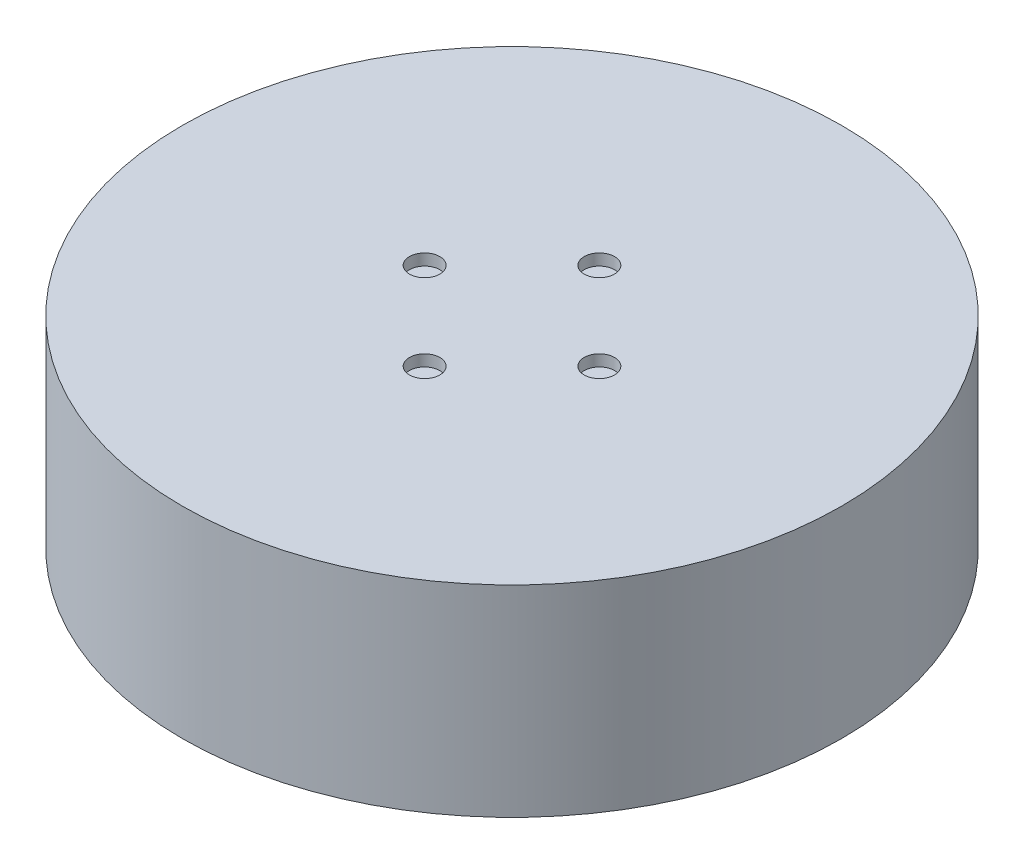
ISO-10303-21;
HEADER;
FILE_DESCRIPTION(('STEP AP214'),'2;1');
FILE_NAME('part.step','',(''),(''),'','','');
FILE_SCHEMA(('AUTOMOTIVE_DESIGN { 1 0 10303 214 1 1 1 1 }'));
ENDSEC;
DATA;
#1=APPLICATION_CONTEXT('core data for automotive mechanical design processes');
#2=APPLICATION_PROTOCOL_DEFINITION('international standard','automotive_design',2000,#1);
#3=PRODUCT_CONTEXT('',#1,'mechanical');
#4=PRODUCT('Part','Part','',(#3));
#5=PRODUCT_RELATED_PRODUCT_CATEGORY('part','',(#4));
#6=PRODUCT_DEFINITION_FORMATION('','',#4);
#7=PRODUCT_DEFINITION_CONTEXT('part definition',#1,'design');
#8=PRODUCT_DEFINITION('design','',#6,#7);
#9=PRODUCT_DEFINITION_SHAPE('','',#8);
#10=(LENGTH_UNIT() NAMED_UNIT(*) SI_UNIT(.MILLI.,.METRE.));
#11=(NAMED_UNIT(*) PLANE_ANGLE_UNIT() SI_UNIT($,.RADIAN.));
#12=(NAMED_UNIT(*) SI_UNIT($,.STERADIAN.) SOLID_ANGLE_UNIT());
#13=UNCERTAINTY_MEASURE_WITH_UNIT(LENGTH_MEASURE(1.E-05),#10,'distance_accuracy_value','');
#14=(GEOMETRIC_REPRESENTATION_CONTEXT(3) GLOBAL_UNCERTAINTY_ASSIGNED_CONTEXT((#13)) GLOBAL_UNIT_ASSIGNED_CONTEXT((#10,
#11,#12)) REPRESENTATION_CONTEXT('',''));
#15=CARTESIAN_POINT('',(0.,0.,0.));
#16=DIRECTION('',(0.,0.,1.));
#17=DIRECTION('',(1.,0.,0.));
#18=AXIS2_PLACEMENT_3D('',#15,#16,#17);
#19=CARTESIAN_POINT('',(0.,0.,0.));
#20=DIRECTION('',(0.,1.,0.));
#21=DIRECTION('',(0.,0.,1.));
#22=AXIS2_PLACEMENT_3D('',#19,#20,#21);
#23=PLANE('',#22);
#24=CARTESIAN_POINT('',(0.,0.,0.));
#25=DIRECTION('',(0.,1.,0.));
#26=DIRECTION('',(0.,0.,1.));
#27=AXIS2_PLACEMENT_3D('',#24,#25,#26);
#28=CIRCLE('',#27,43.4);
#29=CARTESIAN_POINT('',(0.,0.,43.4));
#30=VERTEX_POINT('',#29);
#31=EDGE_CURVE('E43',#30,#30,#28,.T.);
#32=ORIENTED_EDGE('',*,*,#31,.F.);
#33=EDGE_LOOP('',(#32));
#34=FACE_BOUND('',#33,.T.);
#35=CARTESIAN_POINT('',(-16.,0.,0.));
#36=DIRECTION('',(0.,-1.,0.));
#37=DIRECTION('',(0.,0.,-1.));
#38=AXIS2_PLACEMENT_3D('',#35,#36,#37);
#39=CIRCLE('',#38,2.00000000000016);
#40=CARTESIAN_POINT('',(-16.,0.,-2.00000000000017));
#41=VERTEX_POINT('',#40);
#42=EDGE_CURVE('E104',#41,#41,#39,.T.);
#43=ORIENTED_EDGE('',*,*,#42,.F.);
#44=EDGE_LOOP('',(#43));
#45=FACE_BOUND('',#44,.T.);
#46=CARTESIAN_POINT('',(-1.1172740284298E-13,0.,-16.));
#47=DIRECTION('',(0.,-1.,0.));
#48=DIRECTION('',(0.,0.,-1.));
#49=AXIS2_PLACEMENT_3D('',#46,#47,#48);
#50=CIRCLE('',#49,2.);
#51=CARTESIAN_POINT('',(-1.1172740284298E-13,0.,-18.));
#52=VERTEX_POINT('',#51);
#53=EDGE_CURVE('E122',#52,#52,#50,.T.);
#54=ORIENTED_EDGE('',*,*,#53,.F.);
#55=EDGE_LOOP('',(#54));
#56=FACE_BOUND('',#55,.T.);
#57=CARTESIAN_POINT('',(16.,0.,0.));
#58=DIRECTION('',(0.,-1.,0.));
#59=DIRECTION('',(0.,0.,-1.));
#60=AXIS2_PLACEMENT_3D('',#57,#58,#59);
#61=CIRCLE('',#60,2.);
#62=CARTESIAN_POINT('',(16.,0.,-2.00000000000006));
#63=VERTEX_POINT('',#62);
#64=EDGE_CURVE('E116',#63,#63,#61,.T.);
#65=ORIENTED_EDGE('',*,*,#64,.F.);
#66=EDGE_LOOP('',(#65));
#67=FACE_BOUND('',#66,.T.);
#68=CARTESIAN_POINT('',(0.,0.,16.));
#69=DIRECTION('',(0.,-1.,0.));
#70=DIRECTION('',(0.,0.,-1.));
#71=AXIS2_PLACEMENT_3D('',#68,#69,#70);
#72=CIRCLE('',#71,2.);
#73=CARTESIAN_POINT('',(0.,0.,14.));
#74=VERTEX_POINT('',#73);
#75=EDGE_CURVE('E113',#74,#74,#72,.T.);
#76=ORIENTED_EDGE('',*,*,#75,.F.);
#77=EDGE_LOOP('',(#76));
#78=FACE_BOUND('',#77,.T.);
#79=CARTESIAN_POINT('',(17.6776695296637,0.,24.7487373415291));
#80=DIRECTION('',(0.,-1.,0.));
#81=DIRECTION('',(0.,0.,-1.));
#82=AXIS2_PLACEMENT_3D('',#79,#80,#81);
#83=CIRCLE('',#82,3.);
#84=CARTESIAN_POINT('',(19.7989898732234,0.,26.8700576850888));
#85=VERTEX_POINT('',#84);
#86=CARTESIAN_POINT('',(15.5563491861041,0.,22.6274169979695));
#87=VERTEX_POINT('',#86);
#88=EDGE_CURVE('E100',#85,#87,#83,.T.);
#89=ORIENTED_EDGE('',*,*,#88,.F.);
#90=DIRECTION('',(-0.707106781186547,0.,0.707106781186547));
#91=VECTOR('',#90,1.);
#92=CARTESIAN_POINT('',(19.7989898732234,0.,26.8700576850888));
#93=LINE('',#92,#91);
#94=CARTESIAN_POINT('',(26.8700576850888,0.,19.7989898732233));
#95=VERTEX_POINT('',#94);
#96=EDGE_CURVE('E97',#95,#85,#93,.T.);
#97=ORIENTED_EDGE('',*,*,#96,.F.);
#98=CARTESIAN_POINT('',(24.7487373415292,0.,17.6776695296636));
#99=DIRECTION('',(0.,-1.,0.));
#100=DIRECTION('',(0.,0.,-1.));
#101=AXIS2_PLACEMENT_3D('',#98,#99,#100);
#102=CIRCLE('',#101,3.00000000000001);
#103=CARTESIAN_POINT('',(22.6274169979695,0.,15.556349186104));
#104=VERTEX_POINT('',#103);
#105=EDGE_CURVE('E59',#104,#95,#102,.T.);
#106=ORIENTED_EDGE('',*,*,#105,.F.);
#107=DIRECTION('',(0.707106781186547,0.,-0.707106781186548));
#108=VECTOR('',#107,1.);
#109=CARTESIAN_POINT('',(15.5563491861041,0.,22.6274169979695));
#110=LINE('',#109,#108);
#111=EDGE_CURVE('E54',#87,#104,#110,.T.);
#112=ORIENTED_EDGE('',*,*,#111,.F.);
#113=EDGE_LOOP('',(#89,#97,#106,#112));
#114=FACE_BOUND('',#113,.T.);
#115=ADVANCED_FACE('F39',(#34,#45,#56,#67,#78,#114),#23,.F.);
#116=CARTESIAN_POINT('',(0.,26.5,0.));
#117=DIRECTION('',(0.,-1.,0.));
#118=DIRECTION('',(0.,0.,-1.));
#119=AXIS2_PLACEMENT_3D('',#116,#117,#118);
#120=CYLINDRICAL_SURFACE('',#119,43.4);
#121=CARTESIAN_POINT('',(0.,26.5,0.));
#122=DIRECTION('',(0.,1.,0.));
#123=DIRECTION('',(0.,0.,1.));
#124=AXIS2_PLACEMENT_3D('',#121,#122,#123);
#125=CIRCLE('',#124,43.4);
#126=CARTESIAN_POINT('',(0.,26.5,43.4));
#127=VERTEX_POINT('',#126);
#128=EDGE_CURVE('E11',#127,#127,#125,.T.);
#129=ORIENTED_EDGE('',*,*,#128,.F.);
#130=EDGE_LOOP('',(#129));
#131=FACE_BOUND('',#130,.T.);
#132=ORIENTED_EDGE('',*,*,#31,.T.);
#133=EDGE_LOOP('',(#132));
#134=FACE_BOUND('',#133,.T.);
#135=ADVANCED_FACE('F41',(#131,#134),#120,.T.);
#136=CARTESIAN_POINT('',(0.,26.5,0.));
#137=DIRECTION('',(0.,1.,0.));
#138=DIRECTION('',(0.,0.,1.));
#139=AXIS2_PLACEMENT_3D('',#136,#137,#138);
#140=PLANE('',#139);
#141=CARTESIAN_POINT('',(0.,26.5,-11.5));
#142=DIRECTION('',(0.,1.,0.));
#143=DIRECTION('',(0.,0.,1.));
#144=AXIS2_PLACEMENT_3D('',#141,#142,#143);
#145=CIRCLE('',#144,2.);
#146=CARTESIAN_POINT('',(0.,26.5,-9.5));
#147=VERTEX_POINT('',#146);
#148=EDGE_CURVE('E174',#147,#147,#145,.T.);
#149=ORIENTED_EDGE('',*,*,#148,.F.);
#150=EDGE_LOOP('',(#149));
#151=FACE_BOUND('',#150,.T.);
#152=CARTESIAN_POINT('',(11.5,26.5,0.));
#153=DIRECTION('',(0.,1.,0.));
#154=DIRECTION('',(0.,0.,1.));
#155=AXIS2_PLACEMENT_3D('',#152,#153,#154);
#156=CIRCLE('',#155,2.);
#157=CARTESIAN_POINT('',(11.5,26.5,2.));
#158=VERTEX_POINT('',#157);
#159=EDGE_CURVE('E171',#158,#158,#156,.T.);
#160=ORIENTED_EDGE('',*,*,#159,.F.);
#161=EDGE_LOOP('',(#160));
#162=FACE_BOUND('',#161,.T.);
#163=CARTESIAN_POINT('',(0.,26.5,11.5));
#164=DIRECTION('',(0.,1.,0.));
#165=DIRECTION('',(0.,0.,1.));
#166=AXIS2_PLACEMENT_3D('',#163,#164,#165);
#167=CIRCLE('',#166,2.);
#168=CARTESIAN_POINT('',(0.,26.5,13.5));
#169=VERTEX_POINT('',#168);
#170=EDGE_CURVE('E165',#169,#169,#167,.T.);
#171=ORIENTED_EDGE('',*,*,#170,.F.);
#172=EDGE_LOOP('',(#171));
#173=FACE_BOUND('',#172,.T.);
#174=CARTESIAN_POINT('',(-11.5,26.5,0.));
#175=DIRECTION('',(0.,1.,0.));
#176=DIRECTION('',(0.,0.,1.));
#177=AXIS2_PLACEMENT_3D('',#174,#175,#176);
#178=CIRCLE('',#177,2.);
#179=CARTESIAN_POINT('',(-11.5,26.5,2.));
#180=VERTEX_POINT('',#179);
#181=EDGE_CURVE('E159',#180,#180,#178,.T.);
#182=ORIENTED_EDGE('',*,*,#181,.F.);
#183=EDGE_LOOP('',(#182));
#184=FACE_BOUND('',#183,.T.);
#185=ORIENTED_EDGE('',*,*,#128,.T.);
#186=EDGE_LOOP('',(#185));
#187=FACE_BOUND('',#186,.T.);
#188=ADVANCED_FACE('F189',(#151,#162,#173,#184,#187),#140,.T.);
#189=CARTESIAN_POINT('',(-16.,1.5,0.));
#190=DIRECTION('',(0.,-1.,0.));
#191=DIRECTION('',(0.,0.,-1.));
#192=AXIS2_PLACEMENT_3D('',#189,#190,#191);
#193=CYLINDRICAL_SURFACE('',#192,2.00000000000016);
#194=CARTESIAN_POINT('',(-16.,1.5,0.));
#195=DIRECTION('',(0.,-1.,0.));
#196=DIRECTION('',(0.,0.,-1.));
#197=AXIS2_PLACEMENT_3D('',#194,#195,#196);
#198=CIRCLE('',#197,2.00000000000016);
#199=CARTESIAN_POINT('',(-16.,1.5,-2.00000000000017));
#200=VERTEX_POINT('',#199);
#201=EDGE_CURVE('E101',#200,#200,#198,.T.);
#202=ORIENTED_EDGE('',*,*,#201,.F.);
#203=EDGE_LOOP('',(#202));
#204=FACE_BOUND('',#203,.T.);
#205=ORIENTED_EDGE('',*,*,#42,.T.);
#206=EDGE_LOOP('',(#205));
#207=FACE_BOUND('',#206,.T.);
#208=ADVANCED_FACE('F131',(#204,#207),#193,.F.);
#209=CARTESIAN_POINT('',(-16.,1.5,0.));
#210=DIRECTION('',(0.,-1.,0.));
#211=DIRECTION('',(0.,0.,-1.));
#212=AXIS2_PLACEMENT_3D('',#209,#210,#211);
#213=PLANE('',#212);
#214=ORIENTED_EDGE('',*,*,#201,.T.);
#215=EDGE_LOOP('',(#214));
#216=FACE_BOUND('',#215,.T.);
#217=ADVANCED_FACE('F215',(#216),#213,.T.);
#218=CARTESIAN_POINT('',(-1.1172740284298E-13,1.5,-16.));
#219=DIRECTION('',(0.,-1.,0.));
#220=DIRECTION('',(0.,0.,-1.));
#221=AXIS2_PLACEMENT_3D('',#218,#219,#220);
#222=CYLINDRICAL_SURFACE('',#221,2.);
#223=CARTESIAN_POINT('',(-1.1172740284298E-13,1.5,-16.));
#224=DIRECTION('',(0.,-1.,0.));
#225=DIRECTION('',(0.,0.,-1.));
#226=AXIS2_PLACEMENT_3D('',#223,#224,#225);
#227=CIRCLE('',#226,2.);
#228=CARTESIAN_POINT('',(-1.1172740284298E-13,1.5,-18.));
#229=VERTEX_POINT('',#228);
#230=EDGE_CURVE('E125',#229,#229,#227,.T.);
#231=ORIENTED_EDGE('',*,*,#230,.F.);
#232=EDGE_LOOP('',(#231));
#233=FACE_BOUND('',#232,.T.);
#234=ORIENTED_EDGE('',*,*,#53,.T.);
#235=EDGE_LOOP('',(#234));
#236=FACE_BOUND('',#235,.T.);
#237=ADVANCED_FACE('F224',(#233,#236),#222,.F.);
#238=CARTESIAN_POINT('',(-1.1172740284298E-13,1.5,-16.));
#239=DIRECTION('',(0.,-1.,0.));
#240=DIRECTION('',(0.,0.,-1.));
#241=AXIS2_PLACEMENT_3D('',#238,#239,#240);
#242=PLANE('',#241);
#243=ORIENTED_EDGE('',*,*,#230,.T.);
#244=EDGE_LOOP('',(#243));
#245=FACE_BOUND('',#244,.T.);
#246=ADVANCED_FACE('F233',(#245),#242,.T.);
#247=CARTESIAN_POINT('',(16.,1.5,0.));
#248=DIRECTION('',(0.,-1.,0.));
#249=DIRECTION('',(0.,0.,-1.));
#250=AXIS2_PLACEMENT_3D('',#247,#248,#249);
#251=CYLINDRICAL_SURFACE('',#250,2.);
#252=CARTESIAN_POINT('',(16.,1.5,0.));
#253=DIRECTION('',(0.,-1.,0.));
#254=DIRECTION('',(0.,0.,-1.));
#255=AXIS2_PLACEMENT_3D('',#252,#253,#254);
#256=CIRCLE('',#255,2.);
#257=CARTESIAN_POINT('',(16.,1.5,-2.00000000000006));
#258=VERTEX_POINT('',#257);
#259=EDGE_CURVE('E119',#258,#258,#256,.T.);
#260=ORIENTED_EDGE('',*,*,#259,.F.);
#261=EDGE_LOOP('',(#260));
#262=FACE_BOUND('',#261,.T.);
#263=ORIENTED_EDGE('',*,*,#64,.T.);
#264=EDGE_LOOP('',(#263));
#265=FACE_BOUND('',#264,.T.);
#266=ADVANCED_FACE('F242',(#262,#265),#251,.F.);
#267=CARTESIAN_POINT('',(16.,1.5,0.));
#268=DIRECTION('',(0.,-1.,0.));
#269=DIRECTION('',(0.,0.,-1.));
#270=AXIS2_PLACEMENT_3D('',#267,#268,#269);
#271=PLANE('',#270);
#272=ORIENTED_EDGE('',*,*,#259,.T.);
#273=EDGE_LOOP('',(#272));
#274=FACE_BOUND('',#273,.T.);
#275=ADVANCED_FACE('F251',(#274),#271,.T.);
#276=CARTESIAN_POINT('',(0.,1.5,16.));
#277=DIRECTION('',(0.,-1.,0.));
#278=DIRECTION('',(0.,0.,-1.));
#279=AXIS2_PLACEMENT_3D('',#276,#277,#278);
#280=CYLINDRICAL_SURFACE('',#279,2.);
#281=CARTESIAN_POINT('',(0.,1.5,16.));
#282=DIRECTION('',(0.,-1.,0.));
#283=DIRECTION('',(0.,0.,-1.));
#284=AXIS2_PLACEMENT_3D('',#281,#282,#283);
#285=CIRCLE('',#284,2.);
#286=CARTESIAN_POINT('',(0.,1.5,14.));
#287=VERTEX_POINT('',#286);
#288=EDGE_CURVE('E110',#287,#287,#285,.T.);
#289=ORIENTED_EDGE('',*,*,#288,.F.);
#290=EDGE_LOOP('',(#289));
#291=FACE_BOUND('',#290,.T.);
#292=ORIENTED_EDGE('',*,*,#75,.T.);
#293=EDGE_LOOP('',(#292));
#294=FACE_BOUND('',#293,.T.);
#295=ADVANCED_FACE('F260',(#291,#294),#280,.F.);
#296=CARTESIAN_POINT('',(0.,1.5,16.));
#297=DIRECTION('',(0.,-1.,0.));
#298=DIRECTION('',(0.,0.,-1.));
#299=AXIS2_PLACEMENT_3D('',#296,#297,#298);
#300=PLANE('',#299);
#301=ORIENTED_EDGE('',*,*,#288,.T.);
#302=EDGE_LOOP('',(#301));
#303=FACE_BOUND('',#302,.T.);
#304=ADVANCED_FACE('F269',(#303),#300,.T.);
#305=CARTESIAN_POINT('',(17.6776695296637,-6.,24.7487373415291));
#306=DIRECTION('',(0.,1.,0.));
#307=DIRECTION('',(0.,0.,1.));
#308=AXIS2_PLACEMENT_3D('',#305,#306,#307);
#309=CYLINDRICAL_SURFACE('',#308,3.);
#310=ORIENTED_EDGE('',*,*,#88,.T.);
#311=DIRECTION('',(0.,1.,0.));
#312=VECTOR('',#311,1.);
#313=CARTESIAN_POINT('',(15.5563491861041,-6.,22.6274169979695));
#314=LINE('',#313,#312);
#315=CARTESIAN_POINT('',(15.5563491861041,-6.,22.6274169979695));
#316=VERTEX_POINT('',#315);
#317=EDGE_CURVE('E81',#316,#87,#314,.T.);
#318=ORIENTED_EDGE('',*,*,#317,.F.);
#319=CARTESIAN_POINT('',(17.6776695296637,-6.,24.7487373415291));
#320=DIRECTION('',(0.,-1.,0.));
#321=DIRECTION('',(0.,0.,-1.));
#322=AXIS2_PLACEMENT_3D('',#319,#320,#321);
#323=CIRCLE('',#322,3.);
#324=CARTESIAN_POINT('',(19.7989898732234,-6.,26.8700576850888));
#325=VERTEX_POINT('',#324);
#326=EDGE_CURVE('E88',#325,#316,#323,.T.);
#327=ORIENTED_EDGE('',*,*,#326,.F.);
#328=DIRECTION('',(0.,1.,0.));
#329=VECTOR('',#328,1.);
#330=CARTESIAN_POINT('',(19.7989898732234,-6.,26.8700576850888));
#331=LINE('',#330,#329);
#332=EDGE_CURVE('E147',#325,#85,#331,.T.);
#333=ORIENTED_EDGE('',*,*,#332,.T.);
#334=EDGE_LOOP('',(#310,#318,#327,#333));
#335=FACE_BOUND('',#334,.T.);
#336=ADVANCED_FACE('F99',(#335),#309,.T.);
#337=CARTESIAN_POINT('',(15.5563491861041,-6.,22.6274169979695));
#338=DIRECTION('',(0.707106781186548,0.,0.707106781186547));
#339=DIRECTION('',(0.707106781186547,0.,-0.707106781186548));
#340=AXIS2_PLACEMENT_3D('',#337,#338,#339);
#341=PLANE('',#340);
#342=ORIENTED_EDGE('',*,*,#111,.T.);
#343=DIRECTION('',(0.,1.,0.));
#344=VECTOR('',#343,1.);
#345=CARTESIAN_POINT('',(22.6274169979695,-6.,15.556349186104));
#346=LINE('',#345,#344);
#347=CARTESIAN_POINT('',(22.6274169979695,-6.,15.556349186104));
#348=VERTEX_POINT('',#347);
#349=EDGE_CURVE('E84',#348,#104,#346,.T.);
#350=ORIENTED_EDGE('',*,*,#349,.F.);
#351=DIRECTION('',(0.707106781186547,0.,-0.707106781186548));
#352=VECTOR('',#351,1.);
#353=CARTESIAN_POINT('',(15.5563491861041,-6.,22.6274169979695));
#354=LINE('',#353,#352);
#355=EDGE_CURVE('E77',#316,#348,#354,.T.);
#356=ORIENTED_EDGE('',*,*,#355,.F.);
#357=ORIENTED_EDGE('',*,*,#317,.T.);
#358=EDGE_LOOP('',(#342,#350,#356,#357));
#359=FACE_BOUND('',#358,.T.);
#360=ADVANCED_FACE('F79',(#359),#341,.F.);
#361=CARTESIAN_POINT('',(24.7487373415292,-6.,17.6776695296636));
#362=DIRECTION('',(0.,1.,0.));
#363=DIRECTION('',(0.,0.,1.));
#364=AXIS2_PLACEMENT_3D('',#361,#362,#363);
#365=CYLINDRICAL_SURFACE('',#364,3.00000000000001);
#366=ORIENTED_EDGE('',*,*,#105,.T.);
#367=DIRECTION('',(0.,1.,0.));
#368=VECTOR('',#367,1.);
#369=CARTESIAN_POINT('',(26.8700576850888,-6.,19.7989898732233));
#370=LINE('',#369,#368);
#371=CARTESIAN_POINT('',(26.8700576850888,-6.,19.7989898732233));
#372=VERTEX_POINT('',#371);
#373=EDGE_CURVE('E106',#372,#95,#370,.T.);
#374=ORIENTED_EDGE('',*,*,#373,.F.);
#375=CARTESIAN_POINT('',(24.7487373415292,-6.,17.6776695296636));
#376=DIRECTION('',(0.,-1.,0.));
#377=DIRECTION('',(0.,0.,-1.));
#378=AXIS2_PLACEMENT_3D('',#375,#376,#377);
#379=CIRCLE('',#378,3.00000000000001);
#380=EDGE_CURVE('E87',#348,#372,#379,.T.);
#381=ORIENTED_EDGE('',*,*,#380,.F.);
#382=ORIENTED_EDGE('',*,*,#349,.T.);
#383=EDGE_LOOP('',(#366,#374,#381,#382));
#384=FACE_BOUND('',#383,.T.);
#385=ADVANCED_FACE('F297',(#384),#365,.T.);
#386=CARTESIAN_POINT('',(19.7989898732234,-6.,26.8700576850888));
#387=DIRECTION('',(-0.707106781186548,0.,-0.707106781186548));
#388=DIRECTION('',(-0.707106781186548,0.,0.707106781186548));
#389=AXIS2_PLACEMENT_3D('',#386,#387,#388);
#390=PLANE('',#389);
#391=ORIENTED_EDGE('',*,*,#96,.T.);
#392=ORIENTED_EDGE('',*,*,#332,.F.);
#393=DIRECTION('',(-0.707106781186547,0.,0.707106781186547));
#394=VECTOR('',#393,1.);
#395=CARTESIAN_POINT('',(19.7989898732234,-6.,26.8700576850888));
#396=LINE('',#395,#394);
#397=EDGE_CURVE('E93',#372,#325,#396,.T.);
#398=ORIENTED_EDGE('',*,*,#397,.F.);
#399=ORIENTED_EDGE('',*,*,#373,.T.);
#400=EDGE_LOOP('',(#391,#392,#398,#399));
#401=FACE_BOUND('',#400,.T.);
#402=ADVANCED_FACE('F146',(#401),#390,.F.);
#403=CARTESIAN_POINT('',(17.6776695296637,-6.,24.7487373415291));
#404=DIRECTION('',(0.,-1.,0.));
#405=DIRECTION('',(0.,0.,-1.));
#406=AXIS2_PLACEMENT_3D('',#403,#404,#405);
#407=PLANE('',#406);
#408=ORIENTED_EDGE('',*,*,#326,.T.);
#409=ORIENTED_EDGE('',*,*,#355,.T.);
#410=ORIENTED_EDGE('',*,*,#380,.T.);
#411=ORIENTED_EDGE('',*,*,#397,.T.);
#412=EDGE_LOOP('',(#408,#409,#410,#411));
#413=FACE_BOUND('',#412,.T.);
#414=ADVANCED_FACE('F91',(#413),#407,.T.);
#415=CARTESIAN_POINT('',(-11.5,25.,0.));
#416=DIRECTION('',(0.,1.,0.));
#417=DIRECTION('',(0.,0.,1.));
#418=AXIS2_PLACEMENT_3D('',#415,#416,#417);
#419=CYLINDRICAL_SURFACE('',#418,2.);
#420=CARTESIAN_POINT('',(-11.5,25.,0.));
#421=DIRECTION('',(0.,1.,0.));
#422=DIRECTION('',(0.,0.,1.));
#423=AXIS2_PLACEMENT_3D('',#420,#421,#422);
#424=CIRCLE('',#423,2.);
#425=CARTESIAN_POINT('',(-11.5,25.,2.));
#426=VERTEX_POINT('',#425);
#427=EDGE_CURVE('E156',#426,#426,#424,.T.);
#428=ORIENTED_EDGE('',*,*,#427,.F.);
#429=EDGE_LOOP('',(#428));
#430=FACE_BOUND('',#429,.T.);
#431=ORIENTED_EDGE('',*,*,#181,.T.);
#432=EDGE_LOOP('',(#431));
#433=FACE_BOUND('',#432,.T.);
#434=ADVANCED_FACE('F319',(#430,#433),#419,.F.);
#435=CARTESIAN_POINT('',(-11.5,25.,0.));
#436=DIRECTION('',(0.,1.,0.));
#437=DIRECTION('',(0.,0.,1.));
#438=AXIS2_PLACEMENT_3D('',#435,#436,#437);
#439=PLANE('',#438);
#440=ORIENTED_EDGE('',*,*,#427,.T.);
#441=EDGE_LOOP('',(#440));
#442=FACE_BOUND('',#441,.T.);
#443=ADVANCED_FACE('F332',(#442),#439,.T.);
#444=CARTESIAN_POINT('',(0.,25.,11.5));
#445=DIRECTION('',(0.,1.,0.));
#446=DIRECTION('',(0.,0.,1.));
#447=AXIS2_PLACEMENT_3D('',#444,#445,#446);
#448=CYLINDRICAL_SURFACE('',#447,2.);
#449=CARTESIAN_POINT('',(0.,25.,11.5));
#450=DIRECTION('',(0.,1.,0.));
#451=DIRECTION('',(0.,0.,1.));
#452=AXIS2_PLACEMENT_3D('',#449,#450,#451);
#453=CIRCLE('',#452,2.);
#454=CARTESIAN_POINT('',(0.,25.,13.5));
#455=VERTEX_POINT('',#454);
#456=EDGE_CURVE('E162',#455,#455,#453,.T.);
#457=ORIENTED_EDGE('',*,*,#456,.F.);
#458=EDGE_LOOP('',(#457));
#459=FACE_BOUND('',#458,.T.);
#460=ORIENTED_EDGE('',*,*,#170,.T.);
#461=EDGE_LOOP('',(#460));
#462=FACE_BOUND('',#461,.T.);
#463=ADVANCED_FACE('F341',(#459,#462),#448,.F.);
#464=CARTESIAN_POINT('',(0.,25.,11.5));
#465=DIRECTION('',(0.,1.,0.));
#466=DIRECTION('',(0.,0.,1.));
#467=AXIS2_PLACEMENT_3D('',#464,#465,#466);
#468=PLANE('',#467);
#469=ORIENTED_EDGE('',*,*,#456,.T.);
#470=EDGE_LOOP('',(#469));
#471=FACE_BOUND('',#470,.T.);
#472=ADVANCED_FACE('F350',(#471),#468,.T.);
#473=CARTESIAN_POINT('',(11.5,25.,0.));
#474=DIRECTION('',(0.,1.,0.));
#475=DIRECTION('',(0.,0.,1.));
#476=AXIS2_PLACEMENT_3D('',#473,#474,#475);
#477=CYLINDRICAL_SURFACE('',#476,2.);
#478=CARTESIAN_POINT('',(11.5,25.,0.));
#479=DIRECTION('',(0.,1.,0.));
#480=DIRECTION('',(0.,0.,1.));
#481=AXIS2_PLACEMENT_3D('',#478,#479,#480);
#482=CIRCLE('',#481,2.);
#483=CARTESIAN_POINT('',(11.5,25.,2.));
#484=VERTEX_POINT('',#483);
#485=EDGE_CURVE('E168',#484,#484,#482,.T.);
#486=ORIENTED_EDGE('',*,*,#485,.F.);
#487=EDGE_LOOP('',(#486));
#488=FACE_BOUND('',#487,.T.);
#489=ORIENTED_EDGE('',*,*,#159,.T.);
#490=EDGE_LOOP('',(#489));
#491=FACE_BOUND('',#490,.T.);
#492=ADVANCED_FACE('F359',(#488,#491),#477,.F.);
#493=CARTESIAN_POINT('',(11.5,25.,0.));
#494=DIRECTION('',(0.,1.,0.));
#495=DIRECTION('',(0.,0.,1.));
#496=AXIS2_PLACEMENT_3D('',#493,#494,#495);
#497=PLANE('',#496);
#498=ORIENTED_EDGE('',*,*,#485,.T.);
#499=EDGE_LOOP('',(#498));
#500=FACE_BOUND('',#499,.T.);
#501=ADVANCED_FACE('F185',(#500),#497,.T.);
#502=CARTESIAN_POINT('',(0.,25.,-11.5));
#503=DIRECTION('',(0.,1.,0.));
#504=DIRECTION('',(0.,0.,1.));
#505=AXIS2_PLACEMENT_3D('',#502,#503,#504);
#506=CYLINDRICAL_SURFACE('',#505,2.);
#507=CARTESIAN_POINT('',(0.,25.,-11.5));
#508=DIRECTION('',(0.,1.,0.));
#509=DIRECTION('',(0.,0.,1.));
#510=AXIS2_PLACEMENT_3D('',#507,#508,#509);
#511=CIRCLE('',#510,2.);
#512=CARTESIAN_POINT('',(0.,25.,-9.5));
#513=VERTEX_POINT('',#512);
#514=EDGE_CURVE('E142',#513,#513,#511,.T.);
#515=ORIENTED_EDGE('',*,*,#514,.F.);
#516=EDGE_LOOP('',(#515));
#517=FACE_BOUND('',#516,.T.);
#518=ORIENTED_EDGE('',*,*,#148,.T.);
#519=EDGE_LOOP('',(#518));
#520=FACE_BOUND('',#519,.T.);
#521=ADVANCED_FACE('F182',(#517,#520),#506,.F.);
#522=CARTESIAN_POINT('',(0.,25.,-11.5));
#523=DIRECTION('',(0.,1.,0.));
#524=DIRECTION('',(0.,0.,1.));
#525=AXIS2_PLACEMENT_3D('',#522,#523,#524);
#526=PLANE('',#525);
#527=ORIENTED_EDGE('',*,*,#514,.T.);
#528=EDGE_LOOP('',(#527));
#529=FACE_BOUND('',#528,.T.);
#530=ADVANCED_FACE('F180',(#529),#526,.T.);
#531=CLOSED_SHELL('',(#115,#135,#188,#208,#217,#237,#246,#266,#275,#295,#304,#336,#360,#385,
#402,#414,#434,#443,#463,#472,#492,#501,#521,#530));
#532=MANIFOLD_SOLID_BREP('B2',#531);
#533=ADVANCED_BREP_SHAPE_REPRESENTATION('',(#18,#532),#14);
#534=SHAPE_DEFINITION_REPRESENTATION(#9,#533);
ENDSEC;
END-ISO-10303-21;
